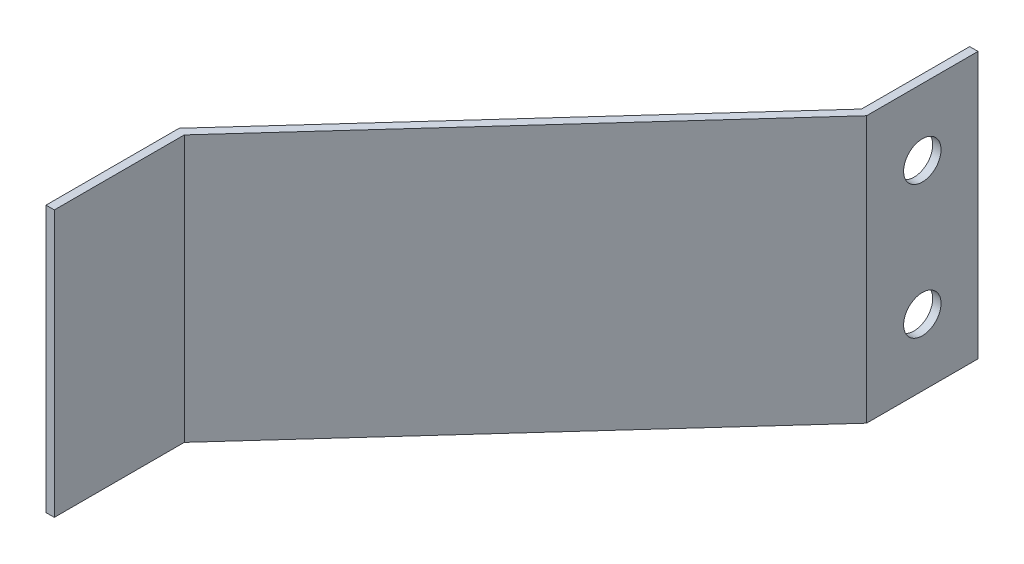
ISO-10303-21;
HEADER;
FILE_DESCRIPTION(('STEP AP214'),'2;1');
FILE_NAME('part.step','',(''),(''),'','','');
FILE_SCHEMA(('AUTOMOTIVE_DESIGN { 1 0 10303 214 1 1 1 1 }'));
ENDSEC;
DATA;
#1=APPLICATION_CONTEXT('core data for automotive mechanical design processes');
#2=APPLICATION_PROTOCOL_DEFINITION('international standard','automotive_design',2000,#1);
#3=PRODUCT_CONTEXT('',#1,'mechanical');
#4=PRODUCT('Part','Part','',(#3));
#5=PRODUCT_RELATED_PRODUCT_CATEGORY('part','',(#4));
#6=PRODUCT_DEFINITION_FORMATION('','',#4);
#7=PRODUCT_DEFINITION_CONTEXT('part definition',#1,'design');
#8=PRODUCT_DEFINITION('design','',#6,#7);
#9=PRODUCT_DEFINITION_SHAPE('','',#8);
#10=(LENGTH_UNIT() NAMED_UNIT(*) SI_UNIT(.MILLI.,.METRE.));
#11=(NAMED_UNIT(*) PLANE_ANGLE_UNIT() SI_UNIT($,.RADIAN.));
#12=(NAMED_UNIT(*) SI_UNIT($,.STERADIAN.) SOLID_ANGLE_UNIT());
#13=UNCERTAINTY_MEASURE_WITH_UNIT(LENGTH_MEASURE(1.E-05),#10,'distance_accuracy_value','');
#14=(GEOMETRIC_REPRESENTATION_CONTEXT(3) GLOBAL_UNCERTAINTY_ASSIGNED_CONTEXT((#13)) GLOBAL_UNIT_ASSIGNED_CONTEXT((#10,
#11,#12)) REPRESENTATION_CONTEXT('',''));
#15=CARTESIAN_POINT('',(0.,0.,0.));
#16=DIRECTION('',(0.,0.,1.));
#17=DIRECTION('',(1.,0.,0.));
#18=AXIS2_PLACEMENT_3D('',#15,#16,#17);
#19=CARTESIAN_POINT('',(0.,101.6,0.));
#20=DIRECTION('',(0.,1.,0.));
#21=DIRECTION('',(0.,0.,1.));
#22=AXIS2_PLACEMENT_3D('',#19,#20,#21);
#23=PLANE('',#22);
#24=DIRECTION('',(0.,0.,-1.));
#25=VECTOR('',#24,1.);
#26=CARTESIAN_POINT('',(-85.725,101.6,0.));
#27=LINE('',#26,#25);
#28=CARTESIAN_POINT('',(-85.725,101.6,129.54));
#29=VERTEX_POINT('',#28);
#30=CARTESIAN_POINT('',(-85.725,101.6,79.9653628455382));
#31=VERTEX_POINT('',#30);
#32=EDGE_CURVE('E144',#29,#31,#27,.T.);
#33=ORIENTED_EDGE('',*,*,#32,.T.);
#34=DIRECTION('',(0.671814938485816,0.,-0.740719034740771));
#35=VECTOR('',#34,1.);
#36=CARTESIAN_POINT('',(-7.24142774719065,101.6,-6.56780656140548));
#37=LINE('',#36,#35);
#38=CARTESIAN_POINT('',(38.1,101.6,-56.5596371544618));
#39=VERTEX_POINT('',#38);
#40=EDGE_CURVE('E137',#31,#39,#37,.T.);
#41=ORIENTED_EDGE('',*,*,#40,.T.);
#42=DIRECTION('',(0.,0.,-1.));
#43=VECTOR('',#42,1.);
#44=CARTESIAN_POINT('',(38.1,101.6,-99.06));
#45=LINE('',#44,#43);
#46=CARTESIAN_POINT('',(38.1,101.6,-99.06));
#47=VERTEX_POINT('',#46);
#48=EDGE_CURVE('E178',#39,#47,#45,.T.);
#49=ORIENTED_EDGE('',*,*,#48,.T.);
#50=DIRECTION('',(-1.,0.,0.));
#51=VECTOR('',#50,1.);
#52=CARTESIAN_POINT('',(-88.9,101.6,-99.06));
#53=LINE('',#52,#51);
#54=CARTESIAN_POINT('',(34.925,101.6,-99.06));
#55=VERTEX_POINT('',#54);
#56=EDGE_CURVE('E180',#47,#55,#53,.T.);
#57=ORIENTED_EDGE('',*,*,#56,.T.);
#58=DIRECTION('',(0.,0.,1.));
#59=VECTOR('',#58,1.);
#60=CARTESIAN_POINT('',(34.925,101.6,0.));
#61=LINE('',#60,#59);
#62=CARTESIAN_POINT('',(34.925,101.6,-57.785));
#63=VERTEX_POINT('',#62);
#64=EDGE_CURVE('E160',#55,#63,#61,.T.);
#65=ORIENTED_EDGE('',*,*,#64,.T.);
#66=DIRECTION('',(-0.671814938485816,0.,0.740719034740771));
#67=VECTOR('',#66,1.);
#68=CARTESIAN_POINT('',(-9.59321068249258,101.6,-8.70081899109792));
#69=LINE('',#68,#67);
#70=CARTESIAN_POINT('',(-88.9,101.6,78.74));
#71=VERTEX_POINT('',#70);
#72=EDGE_CURVE('E155',#63,#71,#69,.T.);
#73=ORIENTED_EDGE('',*,*,#72,.T.);
#74=DIRECTION('',(0.,0.,1.));
#75=VECTOR('',#74,1.);
#76=CARTESIAN_POINT('',(-88.9,101.6,-99.06));
#77=LINE('',#76,#75);
#78=CARTESIAN_POINT('',(-88.9,101.6,129.54));
#79=VERTEX_POINT('',#78);
#80=EDGE_CURVE('E172',#71,#79,#77,.T.);
#81=ORIENTED_EDGE('',*,*,#80,.T.);
#82=DIRECTION('',(1.,0.,0.));
#83=VECTOR('',#82,1.);
#84=CARTESIAN_POINT('',(-88.9,101.6,129.54));
#85=LINE('',#84,#83);
#86=EDGE_CURVE('E174',#79,#29,#85,.T.);
#87=ORIENTED_EDGE('',*,*,#86,.T.);
#88=EDGE_LOOP('',(#33,#41,#49,#57,#65,#73,#81,#87));
#89=FACE_BOUND('',#88,.T.);
#90=ADVANCED_FACE('F58',(#89),#23,.T.);
#91=CARTESIAN_POINT('',(0.,0.,0.));
#92=DIRECTION('',(0.,1.,0.));
#93=DIRECTION('',(0.,0.,1.));
#94=AXIS2_PLACEMENT_3D('',#91,#92,#93);
#95=PLANE('',#94);
#96=DIRECTION('',(0.671814938485816,0.,-0.740719034740771));
#97=VECTOR('',#96,1.);
#98=CARTESIAN_POINT('',(-7.24142774719065,0.,-6.56780656140548));
#99=LINE('',#98,#97);
#100=CARTESIAN_POINT('',(-85.725,0.,79.9653628455382));
#101=VERTEX_POINT('',#100);
#102=CARTESIAN_POINT('',(38.1,0.,-56.5596371544618));
#103=VERTEX_POINT('',#102);
#104=EDGE_CURVE('E75',#101,#103,#99,.T.);
#105=ORIENTED_EDGE('',*,*,#104,.F.);
#106=DIRECTION('',(0.,0.,-1.));
#107=VECTOR('',#106,1.);
#108=CARTESIAN_POINT('',(-85.725,0.,0.));
#109=LINE('',#108,#107);
#110=CARTESIAN_POINT('',(-85.725,0.,129.54));
#111=VERTEX_POINT('',#110);
#112=EDGE_CURVE('E125',#111,#101,#109,.T.);
#113=ORIENTED_EDGE('',*,*,#112,.F.);
#114=DIRECTION('',(1.,0.,0.));
#115=VECTOR('',#114,1.);
#116=CARTESIAN_POINT('',(-88.9,0.,129.54));
#117=LINE('',#116,#115);
#118=CARTESIAN_POINT('',(-88.9,0.,129.54));
#119=VERTEX_POINT('',#118);
#120=EDGE_CURVE('E184',#119,#111,#117,.T.);
#121=ORIENTED_EDGE('',*,*,#120,.F.);
#122=DIRECTION('',(0.,0.,1.));
#123=VECTOR('',#122,1.);
#124=CARTESIAN_POINT('',(-88.9,0.,-99.06));
#125=LINE('',#124,#123);
#126=CARTESIAN_POINT('',(-88.9,0.,78.74));
#127=VERTEX_POINT('',#126);
#128=EDGE_CURVE('E169',#127,#119,#125,.T.);
#129=ORIENTED_EDGE('',*,*,#128,.F.);
#130=DIRECTION('',(-0.671814938485816,0.,0.740719034740771));
#131=VECTOR('',#130,1.);
#132=CARTESIAN_POINT('',(-9.59321068249258,0.,-8.70081899109792));
#133=LINE('',#132,#131);
#134=CARTESIAN_POINT('',(34.925,0.,-57.785));
#135=VERTEX_POINT('',#134);
#136=EDGE_CURVE('E157',#135,#127,#133,.T.);
#137=ORIENTED_EDGE('',*,*,#136,.F.);
#138=DIRECTION('',(0.,0.,1.));
#139=VECTOR('',#138,1.);
#140=CARTESIAN_POINT('',(34.925,0.,0.));
#141=LINE('',#140,#139);
#142=CARTESIAN_POINT('',(34.925,0.,-99.06));
#143=VERTEX_POINT('',#142);
#144=EDGE_CURVE('E159',#143,#135,#141,.T.);
#145=ORIENTED_EDGE('',*,*,#144,.F.);
#146=DIRECTION('',(-1.,0.,0.));
#147=VECTOR('',#146,1.);
#148=CARTESIAN_POINT('',(-88.9,0.,-99.06));
#149=LINE('',#148,#147);
#150=CARTESIAN_POINT('',(38.1,0.,-99.06));
#151=VERTEX_POINT('',#150);
#152=EDGE_CURVE('E175',#151,#143,#149,.T.);
#153=ORIENTED_EDGE('',*,*,#152,.F.);
#154=DIRECTION('',(0.,0.,-1.));
#155=VECTOR('',#154,1.);
#156=CARTESIAN_POINT('',(38.1,0.,-99.06));
#157=LINE('',#156,#155);
#158=EDGE_CURVE('E143',#103,#151,#157,.T.);
#159=ORIENTED_EDGE('',*,*,#158,.F.);
#160=EDGE_LOOP('',(#105,#113,#121,#129,#137,#145,#153,#159));
#161=FACE_BOUND('',#160,.T.);
#162=ADVANCED_FACE('F141',(#161),#95,.F.);
#163=CARTESIAN_POINT('',(-88.9,101.6,129.54));
#164=DIRECTION('',(0.,0.,-1.));
#165=DIRECTION('',(-1.,0.,0.));
#166=AXIS2_PLACEMENT_3D('',#163,#164,#165);
#167=PLANE('',#166);
#168=DIRECTION('',(0.,1.,0.));
#169=VECTOR('',#168,1.);
#170=CARTESIAN_POINT('',(-85.725,0.,129.54));
#171=LINE('',#170,#169);
#172=EDGE_CURVE('E130',#111,#29,#171,.T.);
#173=ORIENTED_EDGE('',*,*,#172,.T.);
#174=ORIENTED_EDGE('',*,*,#86,.F.);
#175=DIRECTION('',(0.,-1.,0.));
#176=VECTOR('',#175,1.);
#177=CARTESIAN_POINT('',(-88.9,101.6,129.54));
#178=LINE('',#177,#176);
#179=EDGE_CURVE('E12',#79,#119,#178,.T.);
#180=ORIENTED_EDGE('',*,*,#179,.T.);
#181=ORIENTED_EDGE('',*,*,#120,.T.);
#182=EDGE_LOOP('',(#173,#174,#180,#181));
#183=FACE_BOUND('',#182,.T.);
#184=ADVANCED_FACE('F208',(#183),#167,.F.);
#185=CARTESIAN_POINT('',(38.1,101.6,-99.06));
#186=DIRECTION('',(-1.,0.,0.));
#187=DIRECTION('',(0.,0.,1.));
#188=AXIS2_PLACEMENT_3D('',#185,#186,#187);
#189=PLANE('',#188);
#190=CARTESIAN_POINT('',(38.1,25.4,-77.8098185772309));
#191=DIRECTION('',(1.,0.,0.));
#192=DIRECTION('',(0.,0.,-1.));
#193=AXIS2_PLACEMENT_3D('',#190,#191,#192);
#194=CIRCLE('',#193,7.14375);
#195=CARTESIAN_POINT('',(38.1,25.4,-84.9535685772309));
#196=VERTEX_POINT('',#195);
#197=EDGE_CURVE('E197',#196,#196,#194,.T.);
#198=ORIENTED_EDGE('',*,*,#197,.F.);
#199=EDGE_LOOP('',(#198));
#200=FACE_BOUND('',#199,.T.);
#201=CARTESIAN_POINT('',(38.1,76.2,-77.8098185772309));
#202=DIRECTION('',(1.,0.,0.));
#203=DIRECTION('',(0.,0.,-1.));
#204=AXIS2_PLACEMENT_3D('',#201,#202,#203);
#205=CIRCLE('',#204,7.14375);
#206=CARTESIAN_POINT('',(38.1,76.2,-84.9535685772309));
#207=VERTEX_POINT('',#206);
#208=EDGE_CURVE('E148',#207,#207,#205,.T.);
#209=ORIENTED_EDGE('',*,*,#208,.F.);
#210=EDGE_LOOP('',(#209));
#211=FACE_BOUND('',#210,.T.);
#212=DIRECTION('',(0.,1.,0.));
#213=VECTOR('',#212,1.);
#214=CARTESIAN_POINT('',(38.1,0.,-56.5596371544618));
#215=LINE('',#214,#213);
#216=EDGE_CURVE('E153',#103,#39,#215,.T.);
#217=ORIENTED_EDGE('',*,*,#216,.F.);
#218=ORIENTED_EDGE('',*,*,#158,.T.);
#219=DIRECTION('',(0.,-1.,0.));
#220=VECTOR('',#219,1.);
#221=CARTESIAN_POINT('',(38.1,101.6,-99.06));
#222=LINE('',#221,#220);
#223=EDGE_CURVE('E67',#47,#151,#222,.T.);
#224=ORIENTED_EDGE('',*,*,#223,.F.);
#225=ORIENTED_EDGE('',*,*,#48,.F.);
#226=EDGE_LOOP('',(#217,#218,#224,#225));
#227=FACE_BOUND('',#226,.T.);
#228=ADVANCED_FACE('F205',(#200,#211,#227),#189,.F.);
#229=CARTESIAN_POINT('',(-88.9,101.6,-99.06));
#230=DIRECTION('',(1.,0.,0.));
#231=DIRECTION('',(0.,0.,-1.));
#232=AXIS2_PLACEMENT_3D('',#229,#230,#231);
#233=PLANE('',#232);
#234=DIRECTION('',(0.,1.,0.));
#235=VECTOR('',#234,1.);
#236=CARTESIAN_POINT('',(-88.9,0.,78.74));
#237=LINE('',#236,#235);
#238=EDGE_CURVE('E167',#127,#71,#237,.T.);
#239=ORIENTED_EDGE('',*,*,#238,.F.);
#240=ORIENTED_EDGE('',*,*,#128,.T.);
#241=ORIENTED_EDGE('',*,*,#179,.F.);
#242=ORIENTED_EDGE('',*,*,#80,.F.);
#243=EDGE_LOOP('',(#239,#240,#241,#242));
#244=FACE_BOUND('',#243,.T.);
#245=ADVANCED_FACE('F60',(#244),#233,.F.);
#246=CARTESIAN_POINT('',(-88.9,101.6,-99.06));
#247=DIRECTION('',(0.,0.,1.));
#248=DIRECTION('',(1.,0.,0.));
#249=AXIS2_PLACEMENT_3D('',#246,#247,#248);
#250=PLANE('',#249);
#251=DIRECTION('',(0.,1.,0.));
#252=VECTOR('',#251,1.);
#253=CARTESIAN_POINT('',(34.925,0.,-99.06));
#254=LINE('',#253,#252);
#255=EDGE_CURVE('E83',#143,#55,#254,.T.);
#256=ORIENTED_EDGE('',*,*,#255,.T.);
#257=ORIENTED_EDGE('',*,*,#56,.F.);
#258=ORIENTED_EDGE('',*,*,#223,.T.);
#259=ORIENTED_EDGE('',*,*,#152,.T.);
#260=EDGE_LOOP('',(#256,#257,#258,#259));
#261=FACE_BOUND('',#260,.T.);
#262=ADVANCED_FACE('F229',(#261),#250,.F.);
#263=CARTESIAN_POINT('',(-9.59321068249258,0.,-8.70081899109792));
#264=DIRECTION('',(-0.740719034740771,0.,-0.671814938485816));
#265=DIRECTION('',(-0.671814938485816,0.,0.740719034740771));
#266=AXIS2_PLACEMENT_3D('',#263,#264,#265);
#267=PLANE('',#266);
#268=ORIENTED_EDGE('',*,*,#72,.F.);
#269=DIRECTION('',(0.,1.,0.));
#270=VECTOR('',#269,1.);
#271=CARTESIAN_POINT('',(34.925,0.,-57.785));
#272=LINE('',#271,#270);
#273=EDGE_CURVE('E162',#135,#63,#272,.T.);
#274=ORIENTED_EDGE('',*,*,#273,.F.);
#275=ORIENTED_EDGE('',*,*,#136,.T.);
#276=ORIENTED_EDGE('',*,*,#238,.T.);
#277=EDGE_LOOP('',(#268,#274,#275,#276));
#278=FACE_BOUND('',#277,.T.);
#279=ADVANCED_FACE('F224',(#278),#267,.T.);
#280=CARTESIAN_POINT('',(34.925,0.,0.));
#281=DIRECTION('',(-1.,0.,0.));
#282=DIRECTION('',(0.,0.,1.));
#283=AXIS2_PLACEMENT_3D('',#280,#281,#282);
#284=PLANE('',#283);
#285=CARTESIAN_POINT('',(34.925,25.4,-77.8098185772309));
#286=DIRECTION('',(-1.,0.,0.));
#287=DIRECTION('',(0.,0.,1.));
#288=AXIS2_PLACEMENT_3D('',#285,#286,#287);
#289=CIRCLE('',#288,7.14375);
#290=CARTESIAN_POINT('',(34.925,25.4,-70.6660685772309));
#291=VERTEX_POINT('',#290);
#292=EDGE_CURVE('E62',#291,#291,#289,.T.);
#293=ORIENTED_EDGE('',*,*,#292,.F.);
#294=EDGE_LOOP('',(#293));
#295=FACE_BOUND('',#294,.T.);
#296=CARTESIAN_POINT('',(34.925,76.2,-77.8098185772309));
#297=DIRECTION('',(-1.,0.,0.));
#298=DIRECTION('',(0.,0.,1.));
#299=AXIS2_PLACEMENT_3D('',#296,#297,#298);
#300=CIRCLE('',#299,7.14375);
#301=CARTESIAN_POINT('',(34.925,76.2,-70.6660685772309));
#302=VERTEX_POINT('',#301);
#303=EDGE_CURVE('E151',#302,#302,#300,.T.);
#304=ORIENTED_EDGE('',*,*,#303,.F.);
#305=EDGE_LOOP('',(#304));
#306=FACE_BOUND('',#305,.T.);
#307=ORIENTED_EDGE('',*,*,#64,.F.);
#308=ORIENTED_EDGE('',*,*,#255,.F.);
#309=ORIENTED_EDGE('',*,*,#144,.T.);
#310=ORIENTED_EDGE('',*,*,#273,.T.);
#311=EDGE_LOOP('',(#307,#308,#309,#310));
#312=FACE_BOUND('',#311,.T.);
#313=ADVANCED_FACE('F227',(#295,#306,#312),#284,.T.);
#314=CARTESIAN_POINT('',(-7.24142774719065,0.,-6.56780656140548));
#315=DIRECTION('',(0.740719034740771,0.,0.671814938485816));
#316=DIRECTION('',(0.671814938485816,0.,-0.740719034740771));
#317=AXIS2_PLACEMENT_3D('',#314,#315,#316);
#318=PLANE('',#317);
#319=ORIENTED_EDGE('',*,*,#40,.F.);
#320=DIRECTION('',(0.,1.,0.));
#321=VECTOR('',#320,1.);
#322=CARTESIAN_POINT('',(-85.725,0.,79.9653628455382));
#323=LINE('',#322,#321);
#324=EDGE_CURVE('E127',#101,#31,#323,.T.);
#325=ORIENTED_EDGE('',*,*,#324,.F.);
#326=ORIENTED_EDGE('',*,*,#104,.T.);
#327=ORIENTED_EDGE('',*,*,#216,.T.);
#328=EDGE_LOOP('',(#319,#325,#326,#327));
#329=FACE_BOUND('',#328,.T.);
#330=ADVANCED_FACE('F135',(#329),#318,.T.);
#331=CARTESIAN_POINT('',(-85.725,0.,0.));
#332=DIRECTION('',(1.,0.,0.));
#333=DIRECTION('',(0.,0.,-1.));
#334=AXIS2_PLACEMENT_3D('',#331,#332,#333);
#335=PLANE('',#334);
#336=ORIENTED_EDGE('',*,*,#32,.F.);
#337=ORIENTED_EDGE('',*,*,#172,.F.);
#338=ORIENTED_EDGE('',*,*,#112,.T.);
#339=ORIENTED_EDGE('',*,*,#324,.T.);
#340=EDGE_LOOP('',(#336,#337,#338,#339));
#341=FACE_BOUND('',#340,.T.);
#342=ADVANCED_FACE('F126',(#341),#335,.T.);
#343=CARTESIAN_POINT('',(-63.5,76.2,-77.8098185772309));
#344=DIRECTION('',(1.,0.,0.));
#345=DIRECTION('',(0.,0.,-1.));
#346=AXIS2_PLACEMENT_3D('',#343,#344,#345);
#347=CYLINDRICAL_SURFACE('',#346,7.14375);
#348=ORIENTED_EDGE('',*,*,#303,.T.);
#349=EDGE_LOOP('',(#348));
#350=FACE_BOUND('',#349,.T.);
#351=ORIENTED_EDGE('',*,*,#208,.T.);
#352=EDGE_LOOP('',(#351));
#353=FACE_BOUND('',#352,.T.);
#354=ADVANCED_FACE('F251',(#350,#353),#347,.F.);
#355=CARTESIAN_POINT('',(-63.5,25.4,-77.8098185772309));
#356=DIRECTION('',(1.,0.,0.));
#357=DIRECTION('',(0.,0.,-1.));
#358=AXIS2_PLACEMENT_3D('',#355,#356,#357);
#359=CYLINDRICAL_SURFACE('',#358,7.14375);
#360=ORIENTED_EDGE('',*,*,#292,.T.);
#361=EDGE_LOOP('',(#360));
#362=FACE_BOUND('',#361,.T.);
#363=ORIENTED_EDGE('',*,*,#197,.T.);
#364=EDGE_LOOP('',(#363));
#365=FACE_BOUND('',#364,.T.);
#366=ADVANCED_FACE('F203',(#362,#365),#359,.F.);
#367=CLOSED_SHELL('',(#90,#162,#184,#228,#245,#262,#279,#313,#330,#342,#354,#366));
#368=MANIFOLD_SOLID_BREP('B2',#367);
#369=ADVANCED_BREP_SHAPE_REPRESENTATION('',(#18,#368),#14);
#370=SHAPE_DEFINITION_REPRESENTATION(#9,#369);
ENDSEC;
END-ISO-10303-21;
